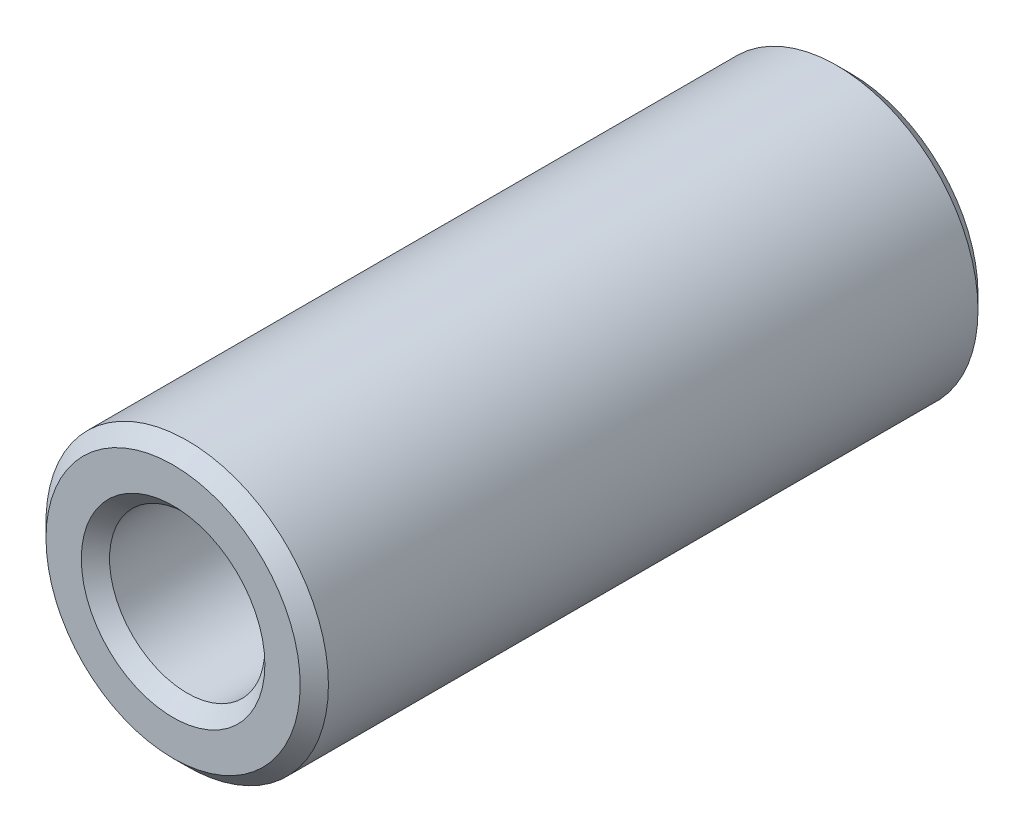
ISO-10303-21;
HEADER;
FILE_DESCRIPTION(('STEP AP214'),'2;1');
FILE_NAME('part.step','',(''),(''),'','','');
FILE_SCHEMA(('AUTOMOTIVE_DESIGN { 1 0 10303 214 1 1 1 1 }'));
ENDSEC;
DATA;
#1=APPLICATION_CONTEXT('core data for automotive mechanical design processes');
#2=APPLICATION_PROTOCOL_DEFINITION('international standard','automotive_design',2000,#1);
#3=PRODUCT_CONTEXT('',#1,'mechanical');
#4=PRODUCT('Part','Part','',(#3));
#5=PRODUCT_RELATED_PRODUCT_CATEGORY('part','',(#4));
#6=PRODUCT_DEFINITION_FORMATION('','',#4);
#7=PRODUCT_DEFINITION_CONTEXT('part definition',#1,'design');
#8=PRODUCT_DEFINITION('design','',#6,#7);
#9=PRODUCT_DEFINITION_SHAPE('','',#8);
#10=(LENGTH_UNIT() NAMED_UNIT(*) SI_UNIT(.MILLI.,.METRE.));
#11=(NAMED_UNIT(*) PLANE_ANGLE_UNIT() SI_UNIT($,.RADIAN.));
#12=(NAMED_UNIT(*) SI_UNIT($,.STERADIAN.) SOLID_ANGLE_UNIT());
#13=UNCERTAINTY_MEASURE_WITH_UNIT(LENGTH_MEASURE(1.E-05),#10,'distance_accuracy_value','');
#14=(GEOMETRIC_REPRESENTATION_CONTEXT(3) GLOBAL_UNCERTAINTY_ASSIGNED_CONTEXT((#13)) GLOBAL_UNIT_ASSIGNED_CONTEXT((#10,
#11,#12)) REPRESENTATION_CONTEXT('',''));
#15=CARTESIAN_POINT('',(0.,0.,0.));
#16=DIRECTION('',(0.,0.,1.));
#17=DIRECTION('',(1.,0.,0.));
#18=AXIS2_PLACEMENT_3D('',#15,#16,#17);
#19=CARTESIAN_POINT('',(0.,0.,24.));
#20=DIRECTION('',(0.,0.,1.));
#21=DIRECTION('',(1.,0.,0.));
#22=AXIS2_PLACEMENT_3D('',#19,#20,#21);
#23=PLANE('',#22);
#24=CARTESIAN_POINT('',(0.,0.,24.));
#25=DIRECTION('',(0.,0.,1.));
#26=DIRECTION('',(1.,0.,0.));
#27=AXIS2_PLACEMENT_3D('',#24,#25,#26);
#28=CIRCLE('',#27,3.25);
#29=CARTESIAN_POINT('',(3.25,0.,24.));
#30=VERTEX_POINT('',#29);
#31=EDGE_CURVE('E10',#30,#30,#28,.F.);
#32=ORIENTED_EDGE('',*,*,#31,.T.);
#33=EDGE_LOOP('',(#32));
#34=FACE_BOUND('',#33,.T.);
#35=CARTESIAN_POINT('',(0.,0.,24.));
#36=DIRECTION('',(0.,0.,1.));
#37=DIRECTION('',(1.,0.,0.));
#38=AXIS2_PLACEMENT_3D('',#35,#36,#37);
#39=CIRCLE('',#38,4.5);
#40=CARTESIAN_POINT('',(4.5,0.,24.));
#41=VERTEX_POINT('',#40);
#42=EDGE_CURVE('E48',#41,#41,#39,.T.);
#43=ORIENTED_EDGE('',*,*,#42,.T.);
#44=EDGE_LOOP('',(#43));
#45=FACE_BOUND('',#44,.T.);
#46=ADVANCED_FACE('F39',(#34,#45),#23,.T.);
#47=CARTESIAN_POINT('',(0.,0.,0.));
#48=DIRECTION('',(0.,0.,1.));
#49=DIRECTION('',(1.,0.,0.));
#50=AXIS2_PLACEMENT_3D('',#47,#48,#49);
#51=PLANE('',#50);
#52=CARTESIAN_POINT('',(0.,0.,0.));
#53=DIRECTION('',(0.,0.,1.));
#54=DIRECTION('',(1.,0.,0.));
#55=AXIS2_PLACEMENT_3D('',#52,#53,#54);
#56=CIRCLE('',#55,3.25);
#57=CARTESIAN_POINT('',(3.25,0.,0.));
#58=VERTEX_POINT('',#57);
#59=EDGE_CURVE('E72',#58,#58,#56,.T.);
#60=ORIENTED_EDGE('',*,*,#59,.T.);
#61=EDGE_LOOP('',(#60));
#62=FACE_BOUND('',#61,.T.);
#63=CARTESIAN_POINT('',(0.,0.,0.));
#64=DIRECTION('',(0.,0.,1.));
#65=DIRECTION('',(1.,0.,0.));
#66=AXIS2_PLACEMENT_3D('',#63,#64,#65);
#67=CIRCLE('',#66,4.5);
#68=CARTESIAN_POINT('',(4.5,0.,0.));
#69=VERTEX_POINT('',#68);
#70=EDGE_CURVE('E76',#69,#69,#67,.F.);
#71=ORIENTED_EDGE('',*,*,#70,.T.);
#72=EDGE_LOOP('',(#71));
#73=FACE_BOUND('',#72,.T.);
#74=ADVANCED_FACE('F81',(#62,#73),#51,.F.);
#75=CARTESIAN_POINT('',(0.,0.,24.));
#76=DIRECTION('',(0.,0.,-1.));
#77=DIRECTION('',(-1.,0.,0.));
#78=AXIS2_PLACEMENT_3D('',#75,#76,#77);
#79=CYLINDRICAL_SURFACE('',#78,5.);
#80=CARTESIAN_POINT('',(0.,0.,0.5));
#81=DIRECTION('',(0.,0.,1.));
#82=DIRECTION('',(1.,0.,0.));
#83=AXIS2_PLACEMENT_3D('',#80,#81,#82);
#84=CIRCLE('',#83,5.);
#85=CARTESIAN_POINT('',(5.,0.,0.5));
#86=VERTEX_POINT('',#85);
#87=EDGE_CURVE('E53',#86,#86,#84,.T.);
#88=ORIENTED_EDGE('',*,*,#87,.T.);
#89=EDGE_LOOP('',(#88));
#90=FACE_BOUND('',#89,.T.);
#91=CARTESIAN_POINT('',(0.,0.,23.5));
#92=DIRECTION('',(0.,0.,1.));
#93=DIRECTION('',(1.,0.,0.));
#94=AXIS2_PLACEMENT_3D('',#91,#92,#93);
#95=CIRCLE('',#94,5.);
#96=CARTESIAN_POINT('',(5.,0.,23.5));
#97=VERTEX_POINT('',#96);
#98=EDGE_CURVE('E58',#97,#97,#95,.F.);
#99=ORIENTED_EDGE('',*,*,#98,.T.);
#100=EDGE_LOOP('',(#99));
#101=FACE_BOUND('',#100,.T.);
#102=ADVANCED_FACE('F91',(#90,#101),#79,.T.);
#103=CARTESIAN_POINT('',(0.,0.,24.));
#104=DIRECTION('',(0.,0.,-1.));
#105=DIRECTION('',(-1.,0.,0.));
#106=AXIS2_PLACEMENT_3D('',#103,#104,#105);
#107=CYLINDRICAL_SURFACE('',#106,2.75);
#108=CARTESIAN_POINT('',(0.,0.,0.5));
#109=DIRECTION('',(0.,0.,1.));
#110=DIRECTION('',(1.,0.,0.));
#111=AXIS2_PLACEMENT_3D('',#108,#109,#110);
#112=CIRCLE('',#111,2.75);
#113=CARTESIAN_POINT('',(2.75,0.,0.5));
#114=VERTEX_POINT('',#113);
#115=EDGE_CURVE('E64',#114,#114,#112,.F.);
#116=ORIENTED_EDGE('',*,*,#115,.T.);
#117=EDGE_LOOP('',(#116));
#118=FACE_BOUND('',#117,.T.);
#119=CARTESIAN_POINT('',(0.,0.,23.5));
#120=DIRECTION('',(0.,0.,1.));
#121=DIRECTION('',(1.,0.,0.));
#122=AXIS2_PLACEMENT_3D('',#119,#120,#121);
#123=CIRCLE('',#122,2.75);
#124=CARTESIAN_POINT('',(2.75,0.,23.5));
#125=VERTEX_POINT('',#124);
#126=EDGE_CURVE('E68',#125,#125,#123,.T.);
#127=ORIENTED_EDGE('',*,*,#126,.T.);
#128=EDGE_LOOP('',(#127));
#129=FACE_BOUND('',#128,.T.);
#130=ADVANCED_FACE('F94',(#118,#129),#107,.F.);
#131=CARTESIAN_POINT('',(0.,0.,0.));
#132=DIRECTION('',(0.,0.,-1.));
#133=DIRECTION('',(-1.,0.,0.));
#134=AXIS2_PLACEMENT_3D('',#131,#132,#133);
#135=CONICAL_SURFACE('',#134,3.25,0.785398163397447);
#136=ORIENTED_EDGE('',*,*,#115,.F.);
#137=EDGE_LOOP('',(#136));
#138=FACE_BOUND('',#137,.T.);
#139=ORIENTED_EDGE('',*,*,#59,.F.);
#140=EDGE_LOOP('',(#139));
#141=FACE_BOUND('',#140,.T.);
#142=ADVANCED_FACE('F87',(#138,#141),#135,.F.);
#143=CARTESIAN_POINT('',(0.,0.,0.5));
#144=DIRECTION('',(0.,0.,1.));
#145=DIRECTION('',(1.,0.,0.));
#146=AXIS2_PLACEMENT_3D('',#143,#144,#145);
#147=CONICAL_SURFACE('',#146,5.,0.785398163397447);
#148=ORIENTED_EDGE('',*,*,#70,.F.);
#149=EDGE_LOOP('',(#148));
#150=FACE_BOUND('',#149,.T.);
#151=ORIENTED_EDGE('',*,*,#87,.F.);
#152=EDGE_LOOP('',(#151));
#153=FACE_BOUND('',#152,.T.);
#154=ADVANCED_FACE('F83',(#150,#153),#147,.T.);
#155=CARTESIAN_POINT('',(0.,0.,23.5));
#156=DIRECTION('',(0.,0.,1.));
#157=DIRECTION('',(1.,0.,0.));
#158=AXIS2_PLACEMENT_3D('',#155,#156,#157);
#159=CONICAL_SURFACE('',#158,2.75,0.785398163397451);
#160=ORIENTED_EDGE('',*,*,#31,.F.);
#161=EDGE_LOOP('',(#160));
#162=FACE_BOUND('',#161,.T.);
#163=ORIENTED_EDGE('',*,*,#126,.F.);
#164=EDGE_LOOP('',(#163));
#165=FACE_BOUND('',#164,.T.);
#166=ADVANCED_FACE('F86',(#162,#165),#159,.F.);
#167=CARTESIAN_POINT('',(0.,0.,24.));
#168=DIRECTION('',(0.,0.,-1.));
#169=DIRECTION('',(-1.,0.,0.));
#170=AXIS2_PLACEMENT_3D('',#167,#168,#169);
#171=CONICAL_SURFACE('',#170,4.5,0.785398163397443);
#172=ORIENTED_EDGE('',*,*,#98,.F.);
#173=EDGE_LOOP('',(#172));
#174=FACE_BOUND('',#173,.T.);
#175=ORIENTED_EDGE('',*,*,#42,.F.);
#176=EDGE_LOOP('',(#175));
#177=FACE_BOUND('',#176,.T.);
#178=ADVANCED_FACE('F42',(#174,#177),#171,.T.);
#179=CLOSED_SHELL('',(#46,#74,#102,#130,#142,#154,#166,#178));
#180=MANIFOLD_SOLID_BREP('B2',#179);
#181=ADVANCED_BREP_SHAPE_REPRESENTATION('',(#18,#180),#14);
#182=SHAPE_DEFINITION_REPRESENTATION(#9,#181);
ENDSEC;
END-ISO-10303-21;
